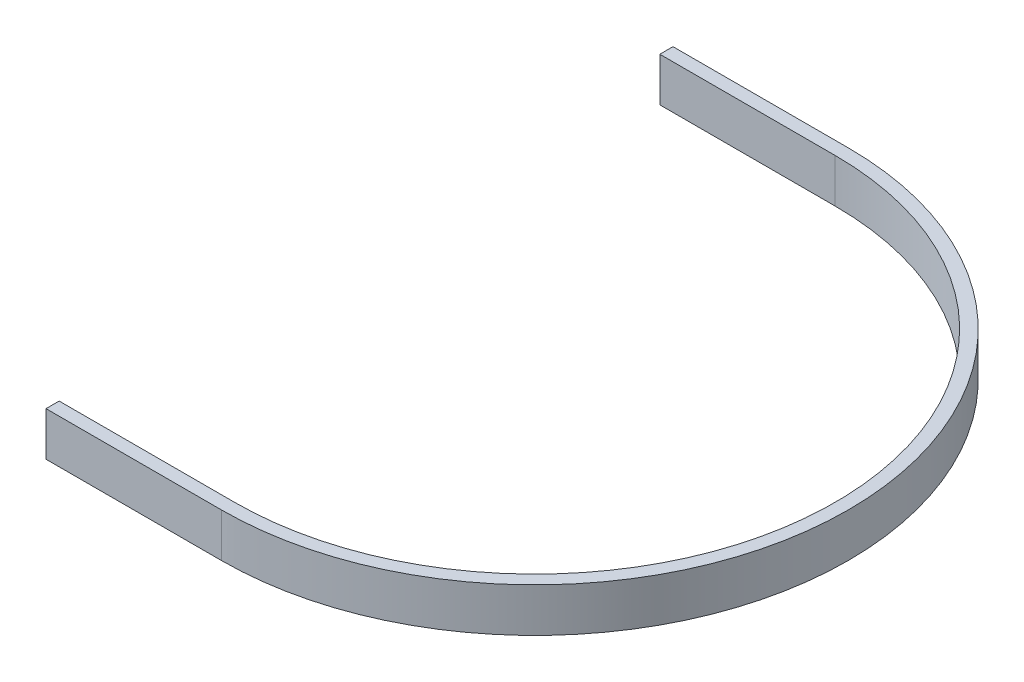
ISO-10303-21;
HEADER;
FILE_DESCRIPTION(('STEP AP214'),'2;1');
FILE_NAME('part.step','',(''),(''),'','','');
FILE_SCHEMA(('AUTOMOTIVE_DESIGN { 1 0 10303 214 1 1 1 1 }'));
ENDSEC;
DATA;
#1=APPLICATION_CONTEXT('core data for automotive mechanical design processes');
#2=APPLICATION_PROTOCOL_DEFINITION('international standard','automotive_design',2000,#1);
#3=PRODUCT_CONTEXT('',#1,'mechanical');
#4=PRODUCT('Part','Part','',(#3));
#5=PRODUCT_RELATED_PRODUCT_CATEGORY('part','',(#4));
#6=PRODUCT_DEFINITION_FORMATION('','',#4);
#7=PRODUCT_DEFINITION_CONTEXT('part definition',#1,'design');
#8=PRODUCT_DEFINITION('design','',#6,#7);
#9=PRODUCT_DEFINITION_SHAPE('','',#8);
#10=(LENGTH_UNIT() NAMED_UNIT(*) SI_UNIT(.MILLI.,.METRE.));
#11=(NAMED_UNIT(*) PLANE_ANGLE_UNIT() SI_UNIT($,.RADIAN.));
#12=(NAMED_UNIT(*) SI_UNIT($,.STERADIAN.) SOLID_ANGLE_UNIT());
#13=UNCERTAINTY_MEASURE_WITH_UNIT(LENGTH_MEASURE(1.E-05),#10,'distance_accuracy_value','');
#14=(GEOMETRIC_REPRESENTATION_CONTEXT(3) GLOBAL_UNCERTAINTY_ASSIGNED_CONTEXT((#13)) GLOBAL_UNIT_ASSIGNED_CONTEXT((#10,
#11,#12)) REPRESENTATION_CONTEXT('',''));
#15=CARTESIAN_POINT('',(0.,0.,0.));
#16=DIRECTION('',(0.,0.,1.));
#17=DIRECTION('',(1.,0.,0.));
#18=AXIS2_PLACEMENT_3D('',#15,#16,#17);
#19=CARTESIAN_POINT('',(0.,10.,0.));
#20=DIRECTION('',(0.,-1.,0.));
#21=DIRECTION('',(0.,0.,-1.));
#22=AXIS2_PLACEMENT_3D('',#19,#20,#21);
#23=CYLINDRICAL_SURFACE('',#22,71.5);
#24=CARTESIAN_POINT('',(0.,0.,0.));
#25=DIRECTION('',(0.,1.,0.));
#26=DIRECTION('',(0.,0.,1.));
#27=AXIS2_PLACEMENT_3D('',#24,#25,#26);
#28=CIRCLE('',#27,71.5);
#29=CARTESIAN_POINT('',(0.,0.,71.5));
#30=VERTEX_POINT('',#29);
#31=CARTESIAN_POINT('',(0.,0.,-71.5));
#32=VERTEX_POINT('',#31);
#33=EDGE_CURVE('E151',#30,#32,#28,.T.);
#34=ORIENTED_EDGE('',*,*,#33,.T.);
#35=DIRECTION('',(0.,-1.,0.));
#36=VECTOR('',#35,1.);
#37=CARTESIAN_POINT('',(0.,10.,-71.5));
#38=LINE('',#37,#36);
#39=CARTESIAN_POINT('',(0.,10.,-71.5));
#40=VERTEX_POINT('',#39);
#41=EDGE_CURVE('E42',#40,#32,#38,.T.);
#42=ORIENTED_EDGE('',*,*,#41,.F.);
#43=CARTESIAN_POINT('',(0.,10.,0.));
#44=DIRECTION('',(0.,1.,0.));
#45=DIRECTION('',(0.,0.,1.));
#46=AXIS2_PLACEMENT_3D('',#43,#44,#45);
#47=CIRCLE('',#46,71.5);
#48=CARTESIAN_POINT('',(0.,10.,71.5));
#49=VERTEX_POINT('',#48);
#50=EDGE_CURVE('E152',#49,#40,#47,.T.);
#51=ORIENTED_EDGE('',*,*,#50,.F.);
#52=DIRECTION('',(0.,-1.,0.));
#53=VECTOR('',#52,1.);
#54=CARTESIAN_POINT('',(0.,10.,71.5));
#55=LINE('',#54,#53);
#56=EDGE_CURVE('E11',#49,#30,#55,.T.);
#57=ORIENTED_EDGE('',*,*,#56,.T.);
#58=EDGE_LOOP('',(#34,#42,#51,#57));
#59=FACE_BOUND('',#58,.T.);
#60=ADVANCED_FACE('F34',(#59),#23,.T.);
#61=CARTESIAN_POINT('',(0.,10.,0.));
#62=DIRECTION('',(0.,-1.,0.));
#63=DIRECTION('',(0.,0.,-1.));
#64=AXIS2_PLACEMENT_3D('',#61,#62,#63);
#65=CYLINDRICAL_SURFACE('',#64,68.5);
#66=CARTESIAN_POINT('',(0.,0.,0.));
#67=DIRECTION('',(0.,1.,0.));
#68=DIRECTION('',(0.,0.,1.));
#69=AXIS2_PLACEMENT_3D('',#66,#67,#68);
#70=CIRCLE('',#69,68.5);
#71=CARTESIAN_POINT('',(0.,0.,68.5));
#72=VERTEX_POINT('',#71);
#73=CARTESIAN_POINT('',(0.,0.,-68.5));
#74=VERTEX_POINT('',#73);
#75=EDGE_CURVE('E155',#72,#74,#70,.T.);
#76=ORIENTED_EDGE('',*,*,#75,.F.);
#77=DIRECTION('',(0.,-1.,0.));
#78=VECTOR('',#77,1.);
#79=CARTESIAN_POINT('',(0.,10.,68.5));
#80=LINE('',#79,#78);
#81=CARTESIAN_POINT('',(0.,10.,68.5));
#82=VERTEX_POINT('',#81);
#83=EDGE_CURVE('E50',#82,#72,#80,.T.);
#84=ORIENTED_EDGE('',*,*,#83,.F.);
#85=CARTESIAN_POINT('',(0.,10.,0.));
#86=DIRECTION('',(0.,1.,0.));
#87=DIRECTION('',(0.,0.,1.));
#88=AXIS2_PLACEMENT_3D('',#85,#86,#87);
#89=CIRCLE('',#88,68.5);
#90=CARTESIAN_POINT('',(0.,10.,-68.5));
#91=VERTEX_POINT('',#90);
#92=EDGE_CURVE('E154',#82,#91,#89,.T.);
#93=ORIENTED_EDGE('',*,*,#92,.T.);
#94=DIRECTION('',(0.,-1.,0.));
#95=VECTOR('',#94,1.);
#96=CARTESIAN_POINT('',(0.,10.,-68.5));
#97=LINE('',#96,#95);
#98=EDGE_CURVE('E162',#91,#74,#97,.T.);
#99=ORIENTED_EDGE('',*,*,#98,.T.);
#100=EDGE_LOOP('',(#76,#84,#93,#99));
#101=FACE_BOUND('',#100,.T.);
#102=ADVANCED_FACE('F177',(#101),#65,.F.);
#103=CARTESIAN_POINT('',(0.,10.,0.));
#104=DIRECTION('',(0.,1.,0.));
#105=DIRECTION('',(0.,0.,1.));
#106=AXIS2_PLACEMENT_3D('',#103,#104,#105);
#107=PLANE('',#106);
#108=ORIENTED_EDGE('',*,*,#92,.F.);
#109=DIRECTION('',(1.,0.,0.));
#110=VECTOR('',#109,1.);
#111=CARTESIAN_POINT('',(-40.,10.,68.5));
#112=LINE('',#111,#110);
#113=CARTESIAN_POINT('',(-40.,10.,68.5));
#114=VERTEX_POINT('',#113);
#115=EDGE_CURVE('E119',#114,#82,#112,.T.);
#116=ORIENTED_EDGE('',*,*,#115,.F.);
#117=DIRECTION('',(0.,0.,-1.));
#118=VECTOR('',#117,1.);
#119=CARTESIAN_POINT('',(-40.,10.,71.5));
#120=LINE('',#119,#118);
#121=CARTESIAN_POINT('',(-40.,10.,71.5));
#122=VERTEX_POINT('',#121);
#123=EDGE_CURVE('E111',#122,#114,#120,.T.);
#124=ORIENTED_EDGE('',*,*,#123,.F.);
#125=DIRECTION('',(1.,0.,0.));
#126=VECTOR('',#125,1.);
#127=CARTESIAN_POINT('',(-40.,10.,71.5));
#128=LINE('',#127,#126);
#129=EDGE_CURVE('E116',#122,#49,#128,.T.);
#130=ORIENTED_EDGE('',*,*,#129,.T.);
#131=ORIENTED_EDGE('',*,*,#50,.T.);
#132=DIRECTION('',(1.,0.,0.));
#133=VECTOR('',#132,1.);
#134=CARTESIAN_POINT('',(-40.,10.,-71.5));
#135=LINE('',#134,#133);
#136=CARTESIAN_POINT('',(-40.,10.,-71.5));
#137=VERTEX_POINT('',#136);
#138=EDGE_CURVE('E147',#137,#40,#135,.T.);
#139=ORIENTED_EDGE('',*,*,#138,.F.);
#140=DIRECTION('',(0.,0.,-1.));
#141=VECTOR('',#140,1.);
#142=CARTESIAN_POINT('',(-40.,10.,-68.5));
#143=LINE('',#142,#141);
#144=CARTESIAN_POINT('',(-40.,10.,-68.5));
#145=VERTEX_POINT('',#144);
#146=EDGE_CURVE('E95',#145,#137,#143,.T.);
#147=ORIENTED_EDGE('',*,*,#146,.F.);
#148=DIRECTION('',(1.,0.,0.));
#149=VECTOR('',#148,1.);
#150=CARTESIAN_POINT('',(-40.,10.,-68.5));
#151=LINE('',#150,#149);
#152=EDGE_CURVE('E149',#145,#91,#151,.T.);
#153=ORIENTED_EDGE('',*,*,#152,.T.);
#154=EDGE_LOOP('',(#108,#116,#124,#130,#131,#139,#147,#153));
#155=FACE_BOUND('',#154,.T.);
#156=ADVANCED_FACE('F113',(#155),#107,.T.);
#157=CARTESIAN_POINT('',(0.,0.,0.));
#158=DIRECTION('',(0.,1.,0.));
#159=DIRECTION('',(0.,0.,1.));
#160=AXIS2_PLACEMENT_3D('',#157,#158,#159);
#161=PLANE('',#160);
#162=ORIENTED_EDGE('',*,*,#33,.F.);
#163=DIRECTION('',(1.,0.,0.));
#164=VECTOR('',#163,1.);
#165=CARTESIAN_POINT('',(-40.,0.,71.5));
#166=LINE('',#165,#164);
#167=CARTESIAN_POINT('',(-40.,0.,71.5));
#168=VERTEX_POINT('',#167);
#169=EDGE_CURVE('E169',#168,#30,#166,.T.);
#170=ORIENTED_EDGE('',*,*,#169,.F.);
#171=DIRECTION('',(0.,0.,1.));
#172=VECTOR('',#171,1.);
#173=CARTESIAN_POINT('',(-40.,0.,71.5));
#174=LINE('',#173,#172);
#175=CARTESIAN_POINT('',(-40.,0.,68.5));
#176=VERTEX_POINT('',#175);
#177=EDGE_CURVE('E128',#176,#168,#174,.T.);
#178=ORIENTED_EDGE('',*,*,#177,.F.);
#179=DIRECTION('',(1.,0.,0.));
#180=VECTOR('',#179,1.);
#181=CARTESIAN_POINT('',(-40.,0.,68.5));
#182=LINE('',#181,#180);
#183=EDGE_CURVE('E137',#176,#72,#182,.T.);
#184=ORIENTED_EDGE('',*,*,#183,.T.);
#185=ORIENTED_EDGE('',*,*,#75,.T.);
#186=DIRECTION('',(1.,0.,0.));
#187=VECTOR('',#186,1.);
#188=CARTESIAN_POINT('',(-40.,0.,-68.5));
#189=LINE('',#188,#187);
#190=CARTESIAN_POINT('',(-40.,0.,-68.5));
#191=VERTEX_POINT('',#190);
#192=EDGE_CURVE('E88',#191,#74,#189,.T.);
#193=ORIENTED_EDGE('',*,*,#192,.F.);
#194=DIRECTION('',(0.,0.,1.));
#195=VECTOR('',#194,1.);
#196=CARTESIAN_POINT('',(-40.,0.,-68.5));
#197=LINE('',#196,#195);
#198=CARTESIAN_POINT('',(-40.,0.,-71.5));
#199=VERTEX_POINT('',#198);
#200=EDGE_CURVE('E70',#199,#191,#197,.T.);
#201=ORIENTED_EDGE('',*,*,#200,.F.);
#202=DIRECTION('',(1.,0.,0.));
#203=VECTOR('',#202,1.);
#204=CARTESIAN_POINT('',(-40.,0.,-71.5));
#205=LINE('',#204,#203);
#206=EDGE_CURVE('E62',#199,#32,#205,.T.);
#207=ORIENTED_EDGE('',*,*,#206,.T.);
#208=EDGE_LOOP('',(#162,#170,#178,#184,#185,#193,#201,#207));
#209=FACE_BOUND('',#208,.T.);
#210=ADVANCED_FACE('F168',(#209),#161,.F.);
#211=CARTESIAN_POINT('',(-40.,10.,-68.5));
#212=DIRECTION('',(0.,0.,-1.));
#213=DIRECTION('',(-1.,0.,0.));
#214=AXIS2_PLACEMENT_3D('',#211,#212,#213);
#215=PLANE('',#214);
#216=ORIENTED_EDGE('',*,*,#98,.F.);
#217=ORIENTED_EDGE('',*,*,#152,.F.);
#218=DIRECTION('',(0.,1.,0.));
#219=VECTOR('',#218,1.);
#220=CARTESIAN_POINT('',(-40.,10.,-68.5));
#221=LINE('',#220,#219);
#222=EDGE_CURVE('E134',#191,#145,#221,.T.);
#223=ORIENTED_EDGE('',*,*,#222,.F.);
#224=ORIENTED_EDGE('',*,*,#192,.T.);
#225=EDGE_LOOP('',(#216,#217,#223,#224));
#226=FACE_BOUND('',#225,.T.);
#227=ADVANCED_FACE('F179',(#226),#215,.F.);
#228=CARTESIAN_POINT('',(-40.,10.,-71.5));
#229=DIRECTION('',(0.,0.,1.));
#230=DIRECTION('',(1.,0.,0.));
#231=AXIS2_PLACEMENT_3D('',#228,#229,#230);
#232=PLANE('',#231);
#233=ORIENTED_EDGE('',*,*,#41,.T.);
#234=ORIENTED_EDGE('',*,*,#206,.F.);
#235=DIRECTION('',(0.,-1.,0.));
#236=VECTOR('',#235,1.);
#237=CARTESIAN_POINT('',(-40.,10.,-71.5));
#238=LINE('',#237,#236);
#239=EDGE_CURVE('E142',#137,#199,#238,.T.);
#240=ORIENTED_EDGE('',*,*,#239,.F.);
#241=ORIENTED_EDGE('',*,*,#138,.T.);
#242=EDGE_LOOP('',(#233,#234,#240,#241));
#243=FACE_BOUND('',#242,.T.);
#244=ADVANCED_FACE('F165',(#243),#232,.F.);
#245=CARTESIAN_POINT('',(-40.,0.,0.));
#246=DIRECTION('',(1.,0.,0.));
#247=DIRECTION('',(0.,0.,-1.));
#248=AXIS2_PLACEMENT_3D('',#245,#246,#247);
#249=PLANE('',#248);
#250=ORIENTED_EDGE('',*,*,#222,.T.);
#251=ORIENTED_EDGE('',*,*,#146,.T.);
#252=ORIENTED_EDGE('',*,*,#239,.T.);
#253=ORIENTED_EDGE('',*,*,#200,.T.);
#254=EDGE_LOOP('',(#250,#251,#252,#253));
#255=FACE_BOUND('',#254,.T.);
#256=ADVANCED_FACE('F180',(#255),#249,.F.);
#257=CARTESIAN_POINT('',(-40.,10.,71.5));
#258=DIRECTION('',(0.,0.,-1.));
#259=DIRECTION('',(-1.,0.,0.));
#260=AXIS2_PLACEMENT_3D('',#257,#258,#259);
#261=PLANE('',#260);
#262=ORIENTED_EDGE('',*,*,#56,.F.);
#263=ORIENTED_EDGE('',*,*,#129,.F.);
#264=DIRECTION('',(0.,1.,0.));
#265=VECTOR('',#264,1.);
#266=CARTESIAN_POINT('',(-40.,10.,71.5));
#267=LINE('',#266,#265);
#268=EDGE_CURVE('E123',#168,#122,#267,.T.);
#269=ORIENTED_EDGE('',*,*,#268,.F.);
#270=ORIENTED_EDGE('',*,*,#169,.T.);
#271=EDGE_LOOP('',(#262,#263,#269,#270));
#272=FACE_BOUND('',#271,.T.);
#273=ADVANCED_FACE('F133',(#272),#261,.F.);
#274=CARTESIAN_POINT('',(-40.,10.,68.5));
#275=DIRECTION('',(0.,0.,1.));
#276=DIRECTION('',(1.,0.,0.));
#277=AXIS2_PLACEMENT_3D('',#274,#275,#276);
#278=PLANE('',#277);
#279=ORIENTED_EDGE('',*,*,#83,.T.);
#280=ORIENTED_EDGE('',*,*,#183,.F.);
#281=DIRECTION('',(0.,-1.,0.));
#282=VECTOR('',#281,1.);
#283=CARTESIAN_POINT('',(-40.,10.,68.5));
#284=LINE('',#283,#282);
#285=EDGE_CURVE('E122',#114,#176,#284,.T.);
#286=ORIENTED_EDGE('',*,*,#285,.F.);
#287=ORIENTED_EDGE('',*,*,#115,.T.);
#288=EDGE_LOOP('',(#279,#280,#286,#287));
#289=FACE_BOUND('',#288,.T.);
#290=ADVANCED_FACE('F176',(#289),#278,.F.);
#291=CARTESIAN_POINT('',(-40.,0.,0.));
#292=DIRECTION('',(1.,0.,0.));
#293=DIRECTION('',(0.,0.,-1.));
#294=AXIS2_PLACEMENT_3D('',#291,#292,#293);
#295=PLANE('',#294);
#296=ORIENTED_EDGE('',*,*,#268,.T.);
#297=ORIENTED_EDGE('',*,*,#123,.T.);
#298=ORIENTED_EDGE('',*,*,#285,.T.);
#299=ORIENTED_EDGE('',*,*,#177,.T.);
#300=EDGE_LOOP('',(#296,#297,#298,#299));
#301=FACE_BOUND('',#300,.T.);
#302=ADVANCED_FACE('F126',(#301),#295,.F.);
#303=CLOSED_SHELL('',(#60,#102,#156,#210,#227,#244,#256,#273,#290,#302));
#304=MANIFOLD_SOLID_BREP('B2',#303);
#305=ADVANCED_BREP_SHAPE_REPRESENTATION('',(#18,#304),#14);
#306=SHAPE_DEFINITION_REPRESENTATION(#9,#305);
ENDSEC;
END-ISO-10303-21;
